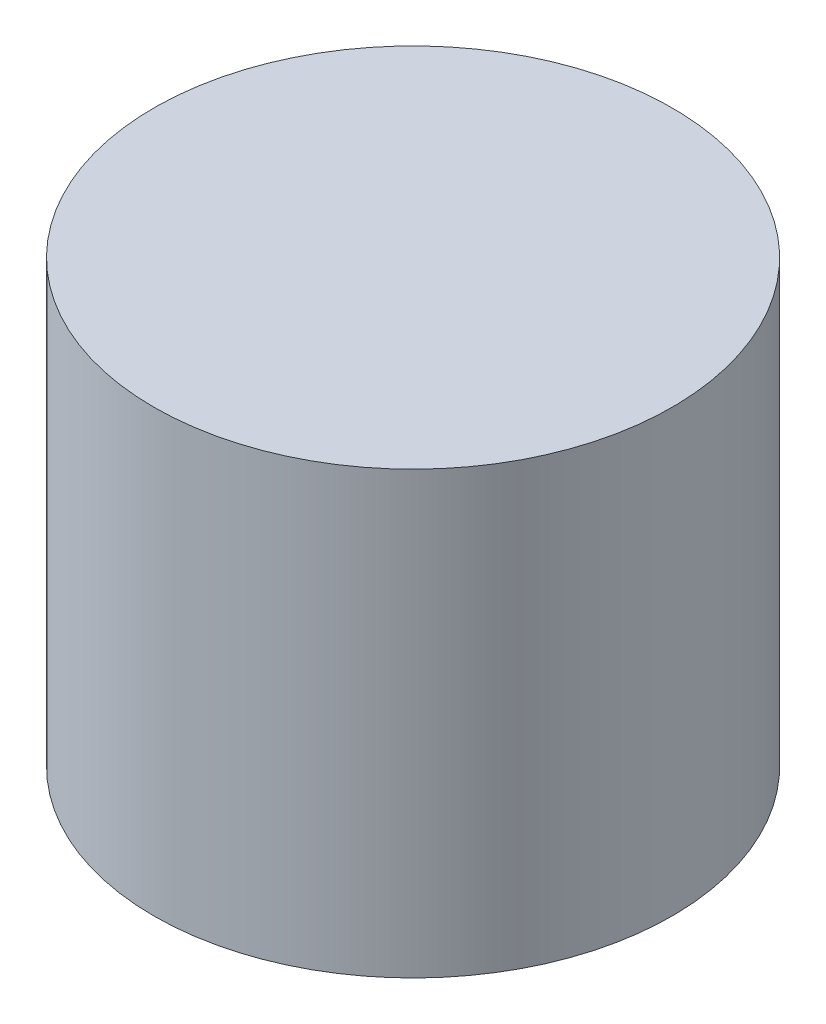
ISO-10303-21;
HEADER;
FILE_DESCRIPTION(('STEP AP214'),'2;1');
FILE_NAME('part.step','',(''),(''),'','','');
FILE_SCHEMA(('AUTOMOTIVE_DESIGN { 1 0 10303 214 1 1 1 1 }'));
ENDSEC;
DATA;
#1=APPLICATION_CONTEXT('core data for automotive mechanical design processes');
#2=APPLICATION_PROTOCOL_DEFINITION('international standard','automotive_design',2000,#1);
#3=PRODUCT_CONTEXT('',#1,'mechanical');
#4=PRODUCT('Part','Part','',(#3));
#5=PRODUCT_RELATED_PRODUCT_CATEGORY('part','',(#4));
#6=PRODUCT_DEFINITION_FORMATION('','',#4);
#7=PRODUCT_DEFINITION_CONTEXT('part definition',#1,'design');
#8=PRODUCT_DEFINITION('design','',#6,#7);
#9=PRODUCT_DEFINITION_SHAPE('','',#8);
#10=(LENGTH_UNIT() NAMED_UNIT(*) SI_UNIT(.MILLI.,.METRE.));
#11=(NAMED_UNIT(*) PLANE_ANGLE_UNIT() SI_UNIT($,.RADIAN.));
#12=(NAMED_UNIT(*) SI_UNIT($,.STERADIAN.) SOLID_ANGLE_UNIT());
#13=UNCERTAINTY_MEASURE_WITH_UNIT(LENGTH_MEASURE(1.E-05),#10,'distance_accuracy_value','');
#14=(GEOMETRIC_REPRESENTATION_CONTEXT(3) GLOBAL_UNCERTAINTY_ASSIGNED_CONTEXT((#13)) GLOBAL_UNIT_ASSIGNED_CONTEXT((#10,
#11,#12)) REPRESENTATION_CONTEXT('',''));
#15=CARTESIAN_POINT('',(0.,0.,0.));
#16=DIRECTION('',(0.,0.,1.));
#17=DIRECTION('',(1.,0.,0.));
#18=AXIS2_PLACEMENT_3D('',#15,#16,#17);
#19=CARTESIAN_POINT('',(0.,17.,0.));
#20=DIRECTION('',(0.,-1.,0.));
#21=DIRECTION('',(0.,0.,-1.));
#22=AXIS2_PLACEMENT_3D('',#19,#20,#21);
#23=CYLINDRICAL_SURFACE('',#22,10.);
#24=CARTESIAN_POINT('',(0.,17.,0.));
#25=DIRECTION('',(0.,1.,0.));
#26=DIRECTION('',(0.,0.,1.));
#27=AXIS2_PLACEMENT_3D('',#24,#25,#26);
#28=CIRCLE('',#27,10.);
#29=CARTESIAN_POINT('',(0.,17.,10.));
#30=VERTEX_POINT('',#29);
#31=EDGE_CURVE('E10',#30,#30,#28,.T.);
#32=ORIENTED_EDGE('',*,*,#31,.F.);
#33=EDGE_LOOP('',(#32));
#34=FACE_BOUND('',#33,.T.);
#35=CARTESIAN_POINT('',(0.,0.,0.));
#36=DIRECTION('',(0.,1.,0.));
#37=DIRECTION('',(0.,0.,1.));
#38=AXIS2_PLACEMENT_3D('',#35,#36,#37);
#39=CIRCLE('',#38,10.);
#40=CARTESIAN_POINT('',(0.,0.,10.));
#41=VERTEX_POINT('',#40);
#42=EDGE_CURVE('E34',#41,#41,#39,.T.);
#43=ORIENTED_EDGE('',*,*,#42,.T.);
#44=EDGE_LOOP('',(#43));
#45=FACE_BOUND('',#44,.T.);
#46=ADVANCED_FACE('F31',(#34,#45),#23,.T.);
#47=CARTESIAN_POINT('',(0.,17.,0.));
#48=DIRECTION('',(0.,1.,0.));
#49=DIRECTION('',(0.,0.,1.));
#50=AXIS2_PLACEMENT_3D('',#47,#48,#49);
#51=PLANE('',#50);
#52=ORIENTED_EDGE('',*,*,#31,.T.);
#53=EDGE_LOOP('',(#52));
#54=FACE_BOUND('',#53,.T.);
#55=ADVANCED_FACE('F46',(#54),#51,.T.);
#56=CARTESIAN_POINT('',(0.,0.,0.));
#57=DIRECTION('',(0.,1.,0.));
#58=DIRECTION('',(0.,0.,1.));
#59=AXIS2_PLACEMENT_3D('',#56,#57,#58);
#60=PLANE('',#59);
#61=ORIENTED_EDGE('',*,*,#42,.F.);
#62=EDGE_LOOP('',(#61));
#63=FACE_BOUND('',#62,.T.);
#64=ADVANCED_FACE('F44',(#63),#60,.F.);
#65=CLOSED_SHELL('',(#46,#55,#64));
#66=MANIFOLD_SOLID_BREP('B2',#65);
#67=ADVANCED_BREP_SHAPE_REPRESENTATION('',(#18,#66),#14);
#68=SHAPE_DEFINITION_REPRESENTATION(#9,#67);
ENDSEC;
END-ISO-10303-21;
